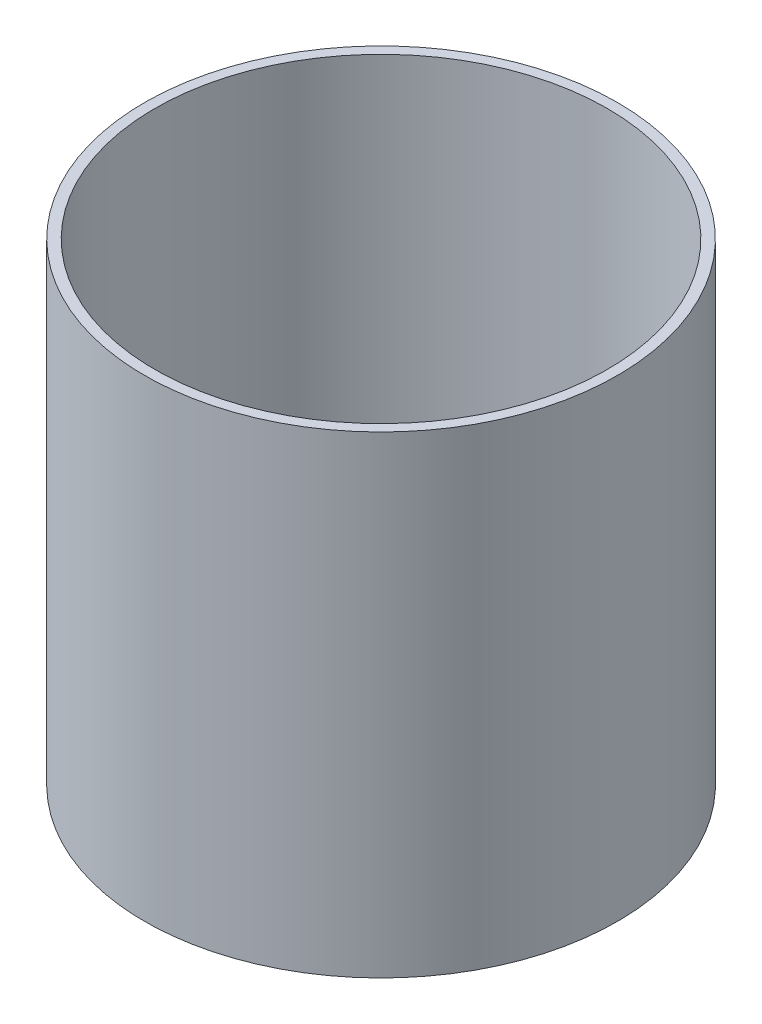
ISO-10303-21;
HEADER;
FILE_DESCRIPTION(('STEP AP214'),'2;1');
FILE_NAME('part.step','',(''),(''),'','','');
FILE_SCHEMA(('AUTOMOTIVE_DESIGN { 1 0 10303 214 1 1 1 1 }'));
ENDSEC;
DATA;
#1=APPLICATION_CONTEXT('core data for automotive mechanical design processes');
#2=APPLICATION_PROTOCOL_DEFINITION('international standard','automotive_design',2000,#1);
#3=PRODUCT_CONTEXT('',#1,'mechanical');
#4=PRODUCT('Part','Part','',(#3));
#5=PRODUCT_RELATED_PRODUCT_CATEGORY('part','',(#4));
#6=PRODUCT_DEFINITION_FORMATION('','',#4);
#7=PRODUCT_DEFINITION_CONTEXT('part definition',#1,'design');
#8=PRODUCT_DEFINITION('design','',#6,#7);
#9=PRODUCT_DEFINITION_SHAPE('','',#8);
#10=(LENGTH_UNIT() NAMED_UNIT(*) SI_UNIT(.MILLI.,.METRE.));
#11=(NAMED_UNIT(*) PLANE_ANGLE_UNIT() SI_UNIT($,.RADIAN.));
#12=(NAMED_UNIT(*) SI_UNIT($,.STERADIAN.) SOLID_ANGLE_UNIT());
#13=UNCERTAINTY_MEASURE_WITH_UNIT(LENGTH_MEASURE(1.E-05),#10,'distance_accuracy_value','');
#14=(GEOMETRIC_REPRESENTATION_CONTEXT(3) GLOBAL_UNCERTAINTY_ASSIGNED_CONTEXT((#13)) GLOBAL_UNIT_ASSIGNED_CONTEXT((#10,
#11,#12)) REPRESENTATION_CONTEXT('',''));
#15=CARTESIAN_POINT('',(0.,0.,0.));
#16=DIRECTION('',(0.,0.,1.));
#17=DIRECTION('',(1.,0.,0.));
#18=AXIS2_PLACEMENT_3D('',#15,#16,#17);
#19=CARTESIAN_POINT('',(0.,76.2,0.));
#20=DIRECTION('',(0.,1.,0.));
#21=DIRECTION('',(0.,0.,1.));
#22=AXIS2_PLACEMENT_3D('',#19,#20,#21);
#23=PLANE('',#22);
#24=CARTESIAN_POINT('',(0.,76.2,0.));
#25=DIRECTION('',(0.,1.,0.));
#26=DIRECTION('',(0.,0.,1.));
#27=AXIS2_PLACEMENT_3D('',#24,#25,#26);
#28=CIRCLE('',#27,38.1);
#29=CARTESIAN_POINT('',(0.,76.2,-38.1));
#30=VERTEX_POINT('',#29);
#31=EDGE_CURVE('E10',#30,#30,#28,.T.);
#32=ORIENTED_EDGE('',*,*,#31,.T.);
#33=EDGE_LOOP('',(#32));
#34=FACE_BOUND('',#33,.T.);
#35=CARTESIAN_POINT('',(0.,76.2,0.));
#36=DIRECTION('',(0.,1.,0.));
#37=DIRECTION('',(0.,0.,1.));
#38=AXIS2_PLACEMENT_3D('',#35,#36,#37);
#39=CIRCLE('',#38,36.449);
#40=CARTESIAN_POINT('',(0.,76.2,-36.449));
#41=VERTEX_POINT('',#40);
#42=EDGE_CURVE('E50',#41,#41,#39,.T.);
#43=ORIENTED_EDGE('',*,*,#42,.F.);
#44=EDGE_LOOP('',(#43));
#45=FACE_BOUND('',#44,.T.);
#46=ADVANCED_FACE('F37',(#34,#45),#23,.T.);
#47=CARTESIAN_POINT('',(0.,0.,0.));
#48=DIRECTION('',(0.,1.,0.));
#49=DIRECTION('',(0.,0.,1.));
#50=AXIS2_PLACEMENT_3D('',#47,#48,#49);
#51=PLANE('',#50);
#52=CARTESIAN_POINT('',(0.,0.,0.));
#53=DIRECTION('',(0.,1.,0.));
#54=DIRECTION('',(0.,0.,1.));
#55=AXIS2_PLACEMENT_3D('',#52,#53,#54);
#56=CIRCLE('',#55,38.1);
#57=CARTESIAN_POINT('',(0.,0.,-38.1));
#58=VERTEX_POINT('',#57);
#59=EDGE_CURVE('E41',#58,#58,#56,.T.);
#60=ORIENTED_EDGE('',*,*,#59,.F.);
#61=EDGE_LOOP('',(#60));
#62=FACE_BOUND('',#61,.T.);
#63=CARTESIAN_POINT('',(0.,0.,0.));
#64=DIRECTION('',(0.,1.,0.));
#65=DIRECTION('',(0.,0.,1.));
#66=AXIS2_PLACEMENT_3D('',#63,#64,#65);
#67=CIRCLE('',#66,36.449);
#68=CARTESIAN_POINT('',(0.,0.,-36.449));
#69=VERTEX_POINT('',#68);
#70=EDGE_CURVE('E52',#69,#69,#67,.T.);
#71=ORIENTED_EDGE('',*,*,#70,.T.);
#72=EDGE_LOOP('',(#71));
#73=FACE_BOUND('',#72,.T.);
#74=ADVANCED_FACE('F64',(#62,#73),#51,.F.);
#75=CARTESIAN_POINT('',(0.,76.2,0.));
#76=DIRECTION('',(0.,-1.,0.));
#77=DIRECTION('',(0.,0.,-1.));
#78=AXIS2_PLACEMENT_3D('',#75,#76,#77);
#79=CYLINDRICAL_SURFACE('',#78,38.1);
#80=CARTESIAN_POINT('',(0.,76.2,-38.1));
#81=CARTESIAN_POINT('',(0.,75.40625,-38.1));
#82=CARTESIAN_POINT('',(0.,74.6125,-38.1));
#83=CARTESIAN_POINT('',(0.,73.025,-38.1));
#84=CARTESIAN_POINT('',(0.,72.23125,-38.1));
#85=CARTESIAN_POINT('',(0.,70.64375,-38.1));
#86=CARTESIAN_POINT('',(0.,69.85,-38.1));
#87=CARTESIAN_POINT('',(0.,68.2625,-38.1));
#88=CARTESIAN_POINT('',(0.,67.46875,-38.1));
#89=CARTESIAN_POINT('',(0.,65.88125,-38.1));
#90=CARTESIAN_POINT('',(0.,65.0875,-38.1));
#91=CARTESIAN_POINT('',(0.,63.5,-38.1));
#92=CARTESIAN_POINT('',(0.,62.70625,-38.1));
#93=CARTESIAN_POINT('',(0.,61.11875,-38.1));
#94=CARTESIAN_POINT('',(0.,60.325,-38.1));
#95=CARTESIAN_POINT('',(0.,58.7375,-38.1));
#96=CARTESIAN_POINT('',(0.,57.94375,-38.1));
#97=CARTESIAN_POINT('',(0.,56.35625,-38.1));
#98=CARTESIAN_POINT('',(0.,55.5625,-38.1));
#99=CARTESIAN_POINT('',(0.,53.975,-38.1));
#100=CARTESIAN_POINT('',(0.,53.18125,-38.1));
#101=CARTESIAN_POINT('',(0.,51.59375,-38.1));
#102=CARTESIAN_POINT('',(0.,50.8,-38.1));
#103=CARTESIAN_POINT('',(0.,49.2125,-38.1));
#104=CARTESIAN_POINT('',(0.,48.41875,-38.1));
#105=CARTESIAN_POINT('',(0.,46.83125,-38.1));
#106=CARTESIAN_POINT('',(0.,46.0375,-38.1));
#107=CARTESIAN_POINT('',(0.,44.45,-38.1));
#108=CARTESIAN_POINT('',(0.,43.65625,-38.1));
#109=CARTESIAN_POINT('',(0.,42.06875,-38.1));
#110=CARTESIAN_POINT('',(0.,41.275,-38.1));
#111=CARTESIAN_POINT('',(0.,39.6875,-38.1));
#112=CARTESIAN_POINT('',(0.,38.89375,-38.1));
#113=CARTESIAN_POINT('',(0.,37.30625,-38.1));
#114=CARTESIAN_POINT('',(0.,36.5125,-38.1));
#115=CARTESIAN_POINT('',(0.,34.925,-38.1));
#116=CARTESIAN_POINT('',(0.,34.13125,-38.1));
#117=CARTESIAN_POINT('',(0.,32.54375,-38.1));
#118=CARTESIAN_POINT('',(0.,31.75,-38.1));
#119=CARTESIAN_POINT('',(0.,30.1625,-38.1));
#120=CARTESIAN_POINT('',(0.,29.36875,-38.1));
#121=CARTESIAN_POINT('',(0.,27.78125,-38.1));
#122=CARTESIAN_POINT('',(0.,26.9875,-38.1));
#123=CARTESIAN_POINT('',(0.,25.4,-38.1));
#124=CARTESIAN_POINT('',(0.,24.60625,-38.1));
#125=CARTESIAN_POINT('',(0.,23.01875,-38.1));
#126=CARTESIAN_POINT('',(0.,22.225,-38.1));
#127=CARTESIAN_POINT('',(0.,20.6375,-38.1));
#128=CARTESIAN_POINT('',(0.,19.84375,-38.1));
#129=CARTESIAN_POINT('',(0.,18.25625,-38.1));
#130=CARTESIAN_POINT('',(0.,17.4625,-38.1));
#131=CARTESIAN_POINT('',(0.,15.875,-38.1));
#132=CARTESIAN_POINT('',(0.,15.08125,-38.1));
#133=CARTESIAN_POINT('',(0.,13.49375,-38.1));
#134=CARTESIAN_POINT('',(0.,12.7,-38.1));
#135=CARTESIAN_POINT('',(0.,11.1125,-38.1));
#136=CARTESIAN_POINT('',(0.,10.31875,-38.1));
#137=CARTESIAN_POINT('',(0.,8.73125,-38.1));
#138=CARTESIAN_POINT('',(0.,7.93750000000001,-38.1));
#139=CARTESIAN_POINT('',(0.,6.35,-38.1));
#140=CARTESIAN_POINT('',(0.,5.55625,-38.1));
#141=CARTESIAN_POINT('',(0.,3.96875,-38.1));
#142=CARTESIAN_POINT('',(0.,3.175,-38.1));
#143=CARTESIAN_POINT('',(0.,1.5875,-38.1));
#144=CARTESIAN_POINT('',(0.,0.793750000000001,-38.1));
#145=CARTESIAN_POINT('',(0.,0.,-38.1));
#146=B_SPLINE_CURVE_WITH_KNOTS('',3,(#80,#81,#82,#83,#84,#85,#86,#87,#88,#89,#90,#91,#92,#93,
#94,#95,#96,#97,#98,#99,#100,#101,#102,#103,#104,#105,#106,#107,#108,#109,#110,#111,#112,#113,
#114,#115,#116,#117,#118,#119,#120,#121,#122,#123,#124,#125,#126,#127,#128,#129,#130,#131,#132,
#133,#134,#135,#136,#137,#138,#139,#140,#141,#142,#143,#144,#145),.UNSPECIFIED.,.F.,.F.,(4,2,2,
2,2,2,2,2,2,2,2,2,2,2,2,2,2,2,2,2,2,2,2,2,2,2,2,2,2,2,2,2,4),(0.,2.38125,4.7625,7.14375,
9.52500000000001,11.90625,14.2875,16.66875,19.05,21.43125,23.8125,26.19375,28.575,30.95625,
33.3375,35.71875,38.1,40.48125,42.8625,45.24375,47.625,50.00625,52.3875,54.76875,57.15,59.53125,
61.9125,64.29375,66.675,69.05625,71.4375,73.81875,76.2),.UNSPECIFIED.);
#147=EDGE_CURVE('BSEAM39',#30,#58,#146,.T.);
#148=ORIENTED_EDGE('',*,*,#31,.F.);
#149=ORIENTED_EDGE('',*,*,#59,.T.);
#150=ORIENTED_EDGE('',*,*,#147,.T.);
#151=ORIENTED_EDGE('',*,*,#147,.F.);
#152=EDGE_LOOP('',(#148,#150,#149,#151));
#153=FACE_BOUND('',#152,.T.);
#154=ADVANCED_FACE('F39',(#153),#79,.T.);
#155=CARTESIAN_POINT('',(0.,76.2,0.));
#156=DIRECTION('',(0.,-1.,0.));
#157=DIRECTION('',(0.,0.,-1.));
#158=AXIS2_PLACEMENT_3D('',#155,#156,#157);
#159=CYLINDRICAL_SURFACE('',#158,36.449);
#160=CARTESIAN_POINT('',(0.,76.2,-36.449));
#161=CARTESIAN_POINT('',(0.,75.40625,-36.449));
#162=CARTESIAN_POINT('',(0.,74.6125,-36.449));
#163=CARTESIAN_POINT('',(0.,73.025,-36.449));
#164=CARTESIAN_POINT('',(0.,72.23125,-36.449));
#165=CARTESIAN_POINT('',(0.,70.64375,-36.449));
#166=CARTESIAN_POINT('',(0.,69.85,-36.449));
#167=CARTESIAN_POINT('',(0.,68.2625,-36.449));
#168=CARTESIAN_POINT('',(0.,67.46875,-36.449));
#169=CARTESIAN_POINT('',(0.,65.88125,-36.449));
#170=CARTESIAN_POINT('',(0.,65.0875,-36.449));
#171=CARTESIAN_POINT('',(0.,63.5,-36.449));
#172=CARTESIAN_POINT('',(0.,62.70625,-36.449));
#173=CARTESIAN_POINT('',(0.,61.11875,-36.449));
#174=CARTESIAN_POINT('',(0.,60.325,-36.449));
#175=CARTESIAN_POINT('',(0.,58.7375,-36.449));
#176=CARTESIAN_POINT('',(0.,57.94375,-36.449));
#177=CARTESIAN_POINT('',(0.,56.35625,-36.449));
#178=CARTESIAN_POINT('',(0.,55.5625,-36.449));
#179=CARTESIAN_POINT('',(0.,53.975,-36.449));
#180=CARTESIAN_POINT('',(0.,53.18125,-36.449));
#181=CARTESIAN_POINT('',(0.,51.59375,-36.449));
#182=CARTESIAN_POINT('',(0.,50.8,-36.449));
#183=CARTESIAN_POINT('',(0.,49.2125,-36.449));
#184=CARTESIAN_POINT('',(0.,48.41875,-36.449));
#185=CARTESIAN_POINT('',(0.,46.83125,-36.449));
#186=CARTESIAN_POINT('',(0.,46.0375,-36.449));
#187=CARTESIAN_POINT('',(0.,44.45,-36.449));
#188=CARTESIAN_POINT('',(0.,43.65625,-36.449));
#189=CARTESIAN_POINT('',(0.,42.06875,-36.449));
#190=CARTESIAN_POINT('',(0.,41.275,-36.449));
#191=CARTESIAN_POINT('',(0.,39.6875,-36.449));
#192=CARTESIAN_POINT('',(0.,38.89375,-36.449));
#193=CARTESIAN_POINT('',(0.,37.30625,-36.449));
#194=CARTESIAN_POINT('',(0.,36.5125,-36.449));
#195=CARTESIAN_POINT('',(0.,34.925,-36.449));
#196=CARTESIAN_POINT('',(0.,34.13125,-36.449));
#197=CARTESIAN_POINT('',(0.,32.54375,-36.449));
#198=CARTESIAN_POINT('',(0.,31.75,-36.449));
#199=CARTESIAN_POINT('',(0.,30.1625,-36.449));
#200=CARTESIAN_POINT('',(0.,29.36875,-36.449));
#201=CARTESIAN_POINT('',(0.,27.78125,-36.449));
#202=CARTESIAN_POINT('',(0.,26.9875,-36.449));
#203=CARTESIAN_POINT('',(0.,25.4,-36.449));
#204=CARTESIAN_POINT('',(0.,24.60625,-36.449));
#205=CARTESIAN_POINT('',(0.,23.01875,-36.449));
#206=CARTESIAN_POINT('',(0.,22.225,-36.449));
#207=CARTESIAN_POINT('',(0.,20.6375,-36.449));
#208=CARTESIAN_POINT('',(0.,19.84375,-36.449));
#209=CARTESIAN_POINT('',(0.,18.25625,-36.449));
#210=CARTESIAN_POINT('',(0.,17.4625,-36.449));
#211=CARTESIAN_POINT('',(0.,15.875,-36.449));
#212=CARTESIAN_POINT('',(0.,15.08125,-36.449));
#213=CARTESIAN_POINT('',(0.,13.49375,-36.449));
#214=CARTESIAN_POINT('',(0.,12.7,-36.449));
#215=CARTESIAN_POINT('',(0.,11.1125,-36.449));
#216=CARTESIAN_POINT('',(0.,10.31875,-36.449));
#217=CARTESIAN_POINT('',(0.,8.73125,-36.449));
#218=CARTESIAN_POINT('',(0.,7.93750000000001,-36.449));
#219=CARTESIAN_POINT('',(0.,6.35,-36.449));
#220=CARTESIAN_POINT('',(0.,5.55625,-36.449));
#221=CARTESIAN_POINT('',(0.,3.96875,-36.449));
#222=CARTESIAN_POINT('',(0.,3.175,-36.449));
#223=CARTESIAN_POINT('',(0.,1.5875,-36.449));
#224=CARTESIAN_POINT('',(0.,0.793750000000001,-36.449));
#225=CARTESIAN_POINT('',(0.,0.,-36.449));
#226=B_SPLINE_CURVE_WITH_KNOTS('',3,(#160,#161,#162,#163,#164,#165,#166,#167,#168,#169,#170,
#171,#172,#173,#174,#175,#176,#177,#178,#179,#180,#181,#182,#183,#184,#185,#186,#187,#188,#189,
#190,#191,#192,#193,#194,#195,#196,#197,#198,#199,#200,#201,#202,#203,#204,#205,#206,#207,#208,
#209,#210,#211,#212,#213,#214,#215,#216,#217,#218,#219,#220,#221,#222,#223,#224,#225),
.UNSPECIFIED.,.F.,.F.,(4,2,2,2,2,2,2,2,2,2,2,2,2,2,2,2,2,2,2,2,2,2,2,2,2,2,2,2,2,2,2,2,4),(0.,
2.38124999999999,4.76249999999999,7.14374999999999,9.52499999999999,11.90625,14.2875,16.66875,
19.05,21.43125,23.8125,26.19375,28.575,30.95625,33.3375,35.71875,38.1,40.48125,42.8625,45.24375,
47.625,50.00625,52.3875,54.76875,57.15,59.53125,61.9125,64.29375,66.675,69.05625,71.4375,
73.81875,76.2),.UNSPECIFIED.);
#227=EDGE_CURVE('BSEAM60',#41,#69,#226,.T.);
#228=ORIENTED_EDGE('',*,*,#42,.T.);
#229=ORIENTED_EDGE('',*,*,#70,.F.);
#230=ORIENTED_EDGE('',*,*,#227,.T.);
#231=ORIENTED_EDGE('',*,*,#227,.F.);
#232=EDGE_LOOP('',(#228,#230,#229,#231));
#233=FACE_BOUND('',#232,.T.);
#234=ADVANCED_FACE('F60',(#233),#159,.F.);
#235=CLOSED_SHELL('',(#46,#74,#154,#234));
#236=MANIFOLD_SOLID_BREP('B2',#235);
#237=ADVANCED_BREP_SHAPE_REPRESENTATION('',(#18,#236),#14);
#238=SHAPE_DEFINITION_REPRESENTATION(#9,#237);
ENDSEC;
END-ISO-10303-21;
